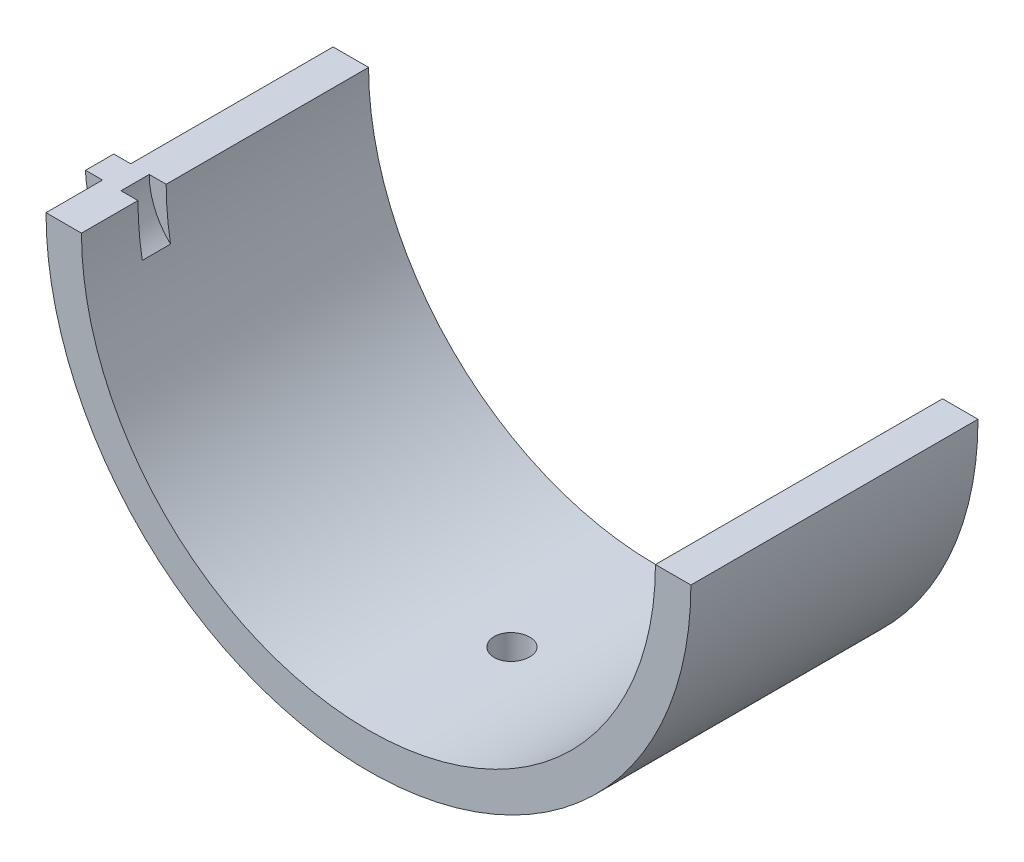
ISO-10303-21;
HEADER;
FILE_DESCRIPTION(('STEP AP214'),'2;1');
FILE_NAME('part.step','',(''),(''),'','','');
FILE_SCHEMA(('AUTOMOTIVE_DESIGN { 1 0 10303 214 1 1 1 1 }'));
ENDSEC;
DATA;
#1=APPLICATION_CONTEXT('core data for automotive mechanical design processes');
#2=APPLICATION_PROTOCOL_DEFINITION('international standard','automotive_design',2000,#1);
#3=PRODUCT_CONTEXT('',#1,'mechanical');
#4=PRODUCT('Part','Part','',(#3));
#5=PRODUCT_RELATED_PRODUCT_CATEGORY('part','',(#4));
#6=PRODUCT_DEFINITION_FORMATION('','',#4);
#7=PRODUCT_DEFINITION_CONTEXT('part definition',#1,'design');
#8=PRODUCT_DEFINITION('design','',#6,#7);
#9=PRODUCT_DEFINITION_SHAPE('','',#8);
#10=(LENGTH_UNIT() NAMED_UNIT(*) SI_UNIT(.MILLI.,.METRE.));
#11=(NAMED_UNIT(*) PLANE_ANGLE_UNIT() SI_UNIT($,.RADIAN.));
#12=(NAMED_UNIT(*) SI_UNIT($,.STERADIAN.) SOLID_ANGLE_UNIT());
#13=UNCERTAINTY_MEASURE_WITH_UNIT(LENGTH_MEASURE(1.E-05),#10,'distance_accuracy_value','');
#14=(GEOMETRIC_REPRESENTATION_CONTEXT(3) GLOBAL_UNCERTAINTY_ASSIGNED_CONTEXT((#13)) GLOBAL_UNIT_ASSIGNED_CONTEXT((#10,
#11,#12)) REPRESENTATION_CONTEXT('',''));
#15=CARTESIAN_POINT('',(0.,0.,0.));
#16=DIRECTION('',(0.,0.,1.));
#17=DIRECTION('',(1.,0.,0.));
#18=AXIS2_PLACEMENT_3D('',#15,#16,#17);
#19=CARTESIAN_POINT('',(0.,36.2585,-32.2834));
#20=DIRECTION('',(0.,0.,1.));
#21=DIRECTION('',(1.,0.,0.));
#22=AXIS2_PLACEMENT_3D('',#19,#20,#21);
#23=CYLINDRICAL_SURFACE('',#22,32.2707);
#24=CARTESIAN_POINT('',(0.,3.9878,-18.1356));
#25=CARTESIAN_POINT('',(-0.111883720965796,3.98780081920386,-18.1355950761488));
#26=CARTESIAN_POINT('',(-0.223845845521155,3.98838808075675,-18.1261511587798));
#27=CARTESIAN_POINT('',(-0.444678748679906,3.99067432506378,-18.0886129498975));
#28=CARTESIAN_POINT('',(-0.553545772229292,3.99237460273192,-18.0604969341903));
#29=CARTESIAN_POINT('',(-0.764957720170871,3.9966945261963,-17.9864250053829));
#30=CARTESIAN_POINT('',(-0.867505939504267,3.99931368798819,-17.9404784828055));
#31=CARTESIAN_POINT('',(-1.06340753096142,4.00517677220651,-17.832064966411));
#32=CARTESIAN_POINT('',(-1.15676300621097,4.00842055122807,-17.7696017634055));
#33=CARTESIAN_POINT('',(-1.33179291448575,4.01517355764292,-17.6298274868831));
#34=CARTESIAN_POINT('',(-1.41345208951588,4.01868312280184,-17.5524973215542));
#35=CARTESIAN_POINT('',(-1.56264093678828,4.02556926803477,-17.3852235216798));
#36=CARTESIAN_POINT('',(-1.63017001945481,4.02894584255499,-17.2952793610789));
#37=CARTESIAN_POINT('',(-1.74922855340307,4.03518781878228,-17.1052446629456));
#38=CARTESIAN_POINT('',(-1.80074536555468,4.03805281592557,-17.0051461924478));
#39=CARTESIAN_POINT('',(-1.88623609918742,4.04294419154457,-16.7976999298791));
#40=CARTESIAN_POINT('',(-1.92021020582116,4.04497057887124,-16.6903522143331));
#41=CARTESIAN_POINT('',(-1.96960887668667,4.04795300982531,-16.4716013505147));
#42=CARTESIAN_POINT('',(-1.98505729255107,4.04891042962738,-16.3602036075208));
#43=CARTESIAN_POINT('',(-1.99703968513226,4.04965107919406,-16.1363923125398));
#44=CARTESIAN_POINT('',(-1.9935738719682,4.04943432200266,-16.0239787718512));
#45=CARTESIAN_POINT('',(-1.96784598637049,4.04785233901447,-15.8014893893565));
#46=CARTESIAN_POINT('',(-1.94560972258169,4.04648869015886,-15.6914105503599));
#47=CARTESIAN_POINT('',(-1.88301217035902,4.04276908353941,-15.4765508628513));
#48=CARTESIAN_POINT('',(-1.84265077533629,4.04041311994005,-15.3717700454996));
#49=CARTESIAN_POINT('',(-1.74491936311942,4.03497257341605,-15.1703978195543));
#50=CARTESIAN_POINT('',(-1.68753763471097,4.03188748910188,-15.0738121088258));
#51=CARTESIAN_POINT('',(-1.55740290289923,4.02533687617385,-14.8916341066089));
#52=CARTESIAN_POINT('',(-1.48464973073931,4.02187134338339,-14.8060419358306));
#53=CARTESIAN_POINT('',(-1.3256919303992,4.01494337714836,-14.6481304978105));
#54=CARTESIAN_POINT('',(-1.23946496541327,4.01148095862902,-14.5758337128163));
#55=CARTESIAN_POINT('',(-1.05608556567461,4.00495499945533,-14.4467386929644));
#56=CARTESIAN_POINT('',(-0.958933127185009,4.00189145893743,-14.3899404634079));
#57=CARTESIAN_POINT('',(-0.756446978490678,3.99650823811199,-14.2934567681121));
#58=CARTESIAN_POINT('',(-0.651112863521814,3.99418859463571,-14.2537721496551));
#59=CARTESIAN_POINT('',(-0.435259487506553,3.99055505959109,-14.1926571761113));
#60=CARTESIAN_POINT('',(-0.324740285659748,3.98924115654289,-14.1712266126663));
#61=CARTESIAN_POINT('',(-0.101849042865441,3.98776863933513,-14.1472559331283));
#62=CARTESIAN_POINT('',(0.0105196431104903,3.98760812413584,-14.1446847324652));
#63=CARTESIAN_POINT('',(0.234091608579501,3.98845541461033,-14.158424552581));
#64=CARTESIAN_POINT('',(0.345294893994785,3.98946321434418,-14.1747354773599));
#65=CARTESIAN_POINT('',(0.563291864281994,3.99253245421689,-14.2257508035571));
#66=CARTESIAN_POINT('',(0.670088898084368,3.99459307760706,-14.2604409477043));
#67=CARTESIAN_POINT('',(0.876345139125459,3.99953612659258,-14.3472155073019));
#68=CARTESIAN_POINT('',(0.975804281843257,4.00241855941288,-14.3993000756765));
#69=CARTESIAN_POINT('',(1.16470382988618,4.0086860585828,-14.5194641513295));
#70=CARTESIAN_POINT('',(1.25413100389011,4.01207177535759,-14.5875644239953));
#71=CARTESIAN_POINT('',(1.42029491780066,4.01896262004217,-14.7377965584471));
#72=CARTESIAN_POINT('',(1.49703153550202,4.02246774910146,-14.8199285553378));
#73=CARTESIAN_POINT('',(1.63574132105311,4.0292078645433,-14.9960267965134));
#74=CARTESIAN_POINT('',(1.6976943259947,4.03244247811934,-15.0900089390133));
#75=CARTESIAN_POINT('',(1.80494035233982,4.03827086171245,-15.2870597282613));
#76=CARTESIAN_POINT('',(1.85023347458754,4.04086463560858,-15.3901283200034));
#77=CARTESIAN_POINT('',(1.92283910089149,4.04511614781028,-15.602352555254));
#78=CARTESIAN_POINT('',(1.9501643058314,4.04677454718073,-15.7115038397928));
#79=CARTESIAN_POINT('',(1.98609991940222,4.0489701256377,-15.9328556378992));
#80=CARTESIAN_POINT('',(1.9947105087489,4.04950731555107,-16.045056122012));
#81=CARTESIAN_POINT('',(1.99297072878972,4.04939963358713,-16.2691208553351));
#82=CARTESIAN_POINT('',(1.98265205997846,4.04875673797713,-16.3809853530192));
#83=CARTESIAN_POINT('',(1.94341238395158,4.04636551882576,-16.6013901988484));
#84=CARTESIAN_POINT('',(1.91449134290751,4.04461719327416,-16.7099305409482));
#85=CARTESIAN_POINT('',(1.83887497917196,4.04021261812829,-16.9206109112672));
#86=CARTESIAN_POINT('',(1.79217976475744,4.03755637406489,-17.0227509784714));
#87=CARTESIAN_POINT('',(1.68234498425625,4.03163534861816,-17.2177454955171));
#88=CARTESIAN_POINT('',(1.61920584905886,4.02837058318088,-17.3106001885803));
#89=CARTESIAN_POINT('',(1.47815851498716,4.02159405823651,-17.4845487774866));
#90=CARTESIAN_POINT('',(1.40022744118492,4.0180819215451,-17.5656241097403));
#91=CARTESIAN_POINT('',(1.23183832809018,4.01120960824321,-17.7135693788049));
#92=CARTESIAN_POINT('',(1.1413772274871,4.00784946903541,-17.780435833984));
#93=CARTESIAN_POINT('',(0.950394954363368,4.00165636867488,-17.898113354332));
#94=CARTESIAN_POINT('',(0.849861648621392,3.99882405538549,-17.9489047413417));
#95=CARTESIAN_POINT('',(0.641749937373601,3.99401450919312,-18.0328251203238));
#96=CARTESIAN_POINT('',(0.534179954306609,3.99203627482298,-18.0659748090935));
#97=CARTESIAN_POINT('',(0.354959357839513,3.9896764947541,-18.1050499610121));
#98=CARTESIAN_POINT('',(0.284467363280514,3.98897593436668,-18.1164914235211));
#99=CARTESIAN_POINT('',(0.142660872419079,3.98803742610515,-18.1317680078167));
#100=CARTESIAN_POINT('',(0.0713463772256011,3.9877994776074,-18.1356031398575));
#101=CARTESIAN_POINT('',(0.,3.9878,-18.1356));
#102=B_SPLINE_CURVE_WITH_KNOTS('',3,(#24,#25,#26,#27,#28,#29,#30,#31,#32,#33,#34,#35,#36,#37,
#38,#39,#40,#41,#42,#43,#44,#45,#46,#47,#48,#49,#50,#51,#52,#53,#54,#55,#56,#57,#58,#59,#60,#61,
#62,#63,#64,#65,#66,#67,#68,#69,#70,#71,#72,#73,#74,#75,#76,#77,#78,#79,#80,#81,#82,#83,#84,#85,
#86,#87,#88,#89,#90,#91,#92,#93,#94,#95,#96,#97,#98,#99,#100,#101),.UNSPECIFIED.,.T.,.F.,(4,2,2,
2,2,2,2,2,2,2,2,2,2,2,2,2,2,2,2,2,2,2,2,2,2,2,2,2,2,2,2,2,2,2,2,2,2,2,4),(0.,0.335390707243431,
0.671172312560252,1.00677731633736,1.34230536078203,1.67826719602565,2.0142430464269,
2.35048342653203,2.68672025775144,3.02252372119828,3.3583234541946,3.69366222616386,
4.02900297019306,4.36457499016749,4.70015069443791,5.03628873535709,5.3724268912468,
5.70858168717771,6.04473264606852,6.38032942605115,6.71592449980721,7.05125962348716,
7.38659769536466,7.72237297519129,8.05815148821871,8.39438537458842,8.73061722566201,
9.06661115013729,9.40260183010715,9.73803034600408,10.0734594718802,10.4088865544172,
10.7443048484544,11.0802461382436,11.4162696497726,11.7527029247478,12.0887406296721,
12.302613961462,12.5164870049252),.UNSPECIFIED.);
#103=CARTESIAN_POINT('',(0.,3.9878,-18.1356));
#104=VERTEX_POINT('',#103);
#105=EDGE_CURVE('E170',#104,#104,#102,.T.);
#106=ORIENTED_EDGE('',*,*,#105,.F.);
#107=EDGE_LOOP('',(#106));
#108=FACE_BOUND('',#107,.T.);
#109=DIRECTION('',(0.,0.,1.));
#110=VECTOR('',#109,1.);
#111=CARTESIAN_POINT('',(-32.2707,36.2585,-32.2834));
#112=LINE('',#111,#110);
#113=CARTESIAN_POINT('',(-32.2707,36.2585,-32.2834));
#114=VERTEX_POINT('',#113);
#115=CARTESIAN_POINT('',(-32.2707,36.2584999999998,-9.525));
#116=VERTEX_POINT('',#115);
#117=EDGE_CURVE('E133',#114,#116,#112,.T.);
#118=ORIENTED_EDGE('',*,*,#117,.T.);
#119=CARTESIAN_POINT('',(0.,36.2584999999999,-9.525));
#120=DIRECTION('',(0.,0.,1.));
#121=DIRECTION('',(1.,0.,0.));
#122=AXIS2_PLACEMENT_3D('',#119,#120,#121);
#123=CIRCLE('',#122,32.2707);
#124=CARTESIAN_POINT('',(-31.7833199892581,30.6711348830217,-9.525));
#125=VERTEX_POINT('',#124);
#126=EDGE_CURVE('E118',#116,#125,#123,.T.);
#127=ORIENTED_EDGE('',*,*,#126,.T.);
#128=DIRECTION('',(0.,0.,1.));
#129=VECTOR('',#128,1.);
#130=CARTESIAN_POINT('',(-31.7833199892581,30.6711348830217,-9.525));
#131=LINE('',#130,#129);
#132=CARTESIAN_POINT('',(-31.7833199892581,30.6711348830217,-6.35));
#133=VERTEX_POINT('',#132);
#134=EDGE_CURVE('E125',#125,#133,#131,.T.);
#135=ORIENTED_EDGE('',*,*,#134,.T.);
#136=CARTESIAN_POINT('',(0.,36.2584999999999,-6.35));
#137=DIRECTION('',(0.,0.,1.));
#138=DIRECTION('',(1.,0.,0.));
#139=AXIS2_PLACEMENT_3D('',#136,#137,#138);
#140=CIRCLE('',#139,32.2707);
#141=CARTESIAN_POINT('',(-32.2707,36.2584999999998,-6.35));
#142=VERTEX_POINT('',#141);
#143=EDGE_CURVE('E140',#142,#133,#140,.T.);
#144=ORIENTED_EDGE('',*,*,#143,.F.);
#145=CARTESIAN_POINT('',(-32.2707,36.2585,0.));
#146=VERTEX_POINT('',#145);
#147=EDGE_CURVE('E250',#142,#146,#112,.T.);
#148=ORIENTED_EDGE('',*,*,#147,.T.);
#149=CARTESIAN_POINT('',(0.,36.2585,0.));
#150=DIRECTION('',(0.,0.,-1.));
#151=DIRECTION('',(-1.,0.,0.));
#152=AXIS2_PLACEMENT_3D('',#149,#150,#151);
#153=CIRCLE('',#152,32.2707);
#154=CARTESIAN_POINT('',(32.2707,36.2585,0.));
#155=VERTEX_POINT('',#154);
#156=EDGE_CURVE('E233',#155,#146,#153,.T.);
#157=ORIENTED_EDGE('',*,*,#156,.F.);
#158=DIRECTION('',(0.,0.,1.));
#159=VECTOR('',#158,1.);
#160=CARTESIAN_POINT('',(32.2707,36.2585,-32.2834));
#161=LINE('',#160,#159);
#162=CARTESIAN_POINT('',(32.2707,36.2585,-32.2834));
#163=VERTEX_POINT('',#162);
#164=EDGE_CURVE('E229',#163,#155,#161,.T.);
#165=ORIENTED_EDGE('',*,*,#164,.F.);
#166=CARTESIAN_POINT('',(0.,36.2585,-32.2834));
#167=DIRECTION('',(0.,0.,-1.));
#168=DIRECTION('',(-1.,0.,0.));
#169=AXIS2_PLACEMENT_3D('',#166,#167,#168);
#170=CIRCLE('',#169,32.2707);
#171=EDGE_CURVE('E253',#163,#114,#170,.T.);
#172=ORIENTED_EDGE('',*,*,#171,.T.);
#173=EDGE_LOOP('',(#118,#127,#135,#144,#148,#157,#165,#172));
#174=FACE_BOUND('',#173,.T.);
#175=ADVANCED_FACE('F36',(#108,#174),#23,.F.);
#176=CARTESIAN_POINT('',(-36.2585,36.2585,-32.2834));
#177=DIRECTION('',(0.,1.,0.));
#178=DIRECTION('',(0.,0.,1.));
#179=AXIS2_PLACEMENT_3D('',#176,#177,#178);
#180=PLANE('',#179);
#181=DIRECTION('',(0.,0.,1.));
#182=VECTOR('',#181,1.);
#183=CARTESIAN_POINT('',(-34.1757,36.2585,-9.525));
#184=LINE('',#183,#182);
#185=CARTESIAN_POINT('',(-34.1757,36.2585,-9.525));
#186=VERTEX_POINT('',#185);
#187=CARTESIAN_POINT('',(-34.1757,36.2585,-6.35));
#188=VERTEX_POINT('',#187);
#189=EDGE_CURVE('E129',#186,#188,#184,.T.);
#190=ORIENTED_EDGE('',*,*,#189,.F.);
#191=DIRECTION('',(-1.,1.12916383738123E-13,0.));
#192=VECTOR('',#191,1.);
#193=CARTESIAN_POINT('',(-32.2707,36.2584999999998,-9.525));
#194=LINE('',#193,#192);
#195=EDGE_CURVE('E120',#116,#186,#194,.T.);
#196=ORIENTED_EDGE('',*,*,#195,.F.);
#197=ORIENTED_EDGE('',*,*,#117,.F.);
#198=DIRECTION('',(-1.,0.,0.));
#199=VECTOR('',#198,1.);
#200=CARTESIAN_POINT('',(-36.2585,36.2585,-32.2834));
#201=LINE('',#200,#199);
#202=CARTESIAN_POINT('',(-36.2585,36.2585,-32.2834));
#203=VERTEX_POINT('',#202);
#204=EDGE_CURVE('E244',#114,#203,#201,.T.);
#205=ORIENTED_EDGE('',*,*,#204,.T.);
#206=DIRECTION('',(0.,0.,1.));
#207=VECTOR('',#206,1.);
#208=CARTESIAN_POINT('',(-36.2585,36.2585,-32.2834));
#209=LINE('',#208,#207);
#210=CARTESIAN_POINT('',(-36.2585,36.2585,-9.525));
#211=VERTEX_POINT('',#210);
#212=EDGE_CURVE('E11',#203,#211,#209,.T.);
#213=ORIENTED_EDGE('',*,*,#212,.T.);
#214=DIRECTION('',(-1.,0.,0.));
#215=VECTOR('',#214,1.);
#216=CARTESIAN_POINT('',(-36.2585,36.2585,-9.525));
#217=LINE('',#216,#215);
#218=CARTESIAN_POINT('',(-38.1635,36.2585,-9.525));
#219=VERTEX_POINT('',#218);
#220=EDGE_CURVE('E144',#211,#219,#217,.T.);
#221=ORIENTED_EDGE('',*,*,#220,.T.);
#222=DIRECTION('',(0.,0.,1.));
#223=VECTOR('',#222,1.);
#224=CARTESIAN_POINT('',(-38.1635,36.2585,-9.525));
#225=LINE('',#224,#223);
#226=CARTESIAN_POINT('',(-38.1635,36.2585,-6.35));
#227=VERTEX_POINT('',#226);
#228=EDGE_CURVE('E152',#219,#227,#225,.T.);
#229=ORIENTED_EDGE('',*,*,#228,.T.);
#230=DIRECTION('',(-1.,0.,0.));
#231=VECTOR('',#230,1.);
#232=CARTESIAN_POINT('',(-36.2585,36.2585,-6.35));
#233=LINE('',#232,#231);
#234=CARTESIAN_POINT('',(-36.2585,36.2585,-6.35));
#235=VERTEX_POINT('',#234);
#236=EDGE_CURVE('E61',#235,#227,#233,.T.);
#237=ORIENTED_EDGE('',*,*,#236,.F.);
#238=CARTESIAN_POINT('',(-36.2585,36.2585,0.));
#239=VERTEX_POINT('',#238);
#240=EDGE_CURVE('E45',#235,#239,#209,.T.);
#241=ORIENTED_EDGE('',*,*,#240,.T.);
#242=DIRECTION('',(-1.,0.,0.));
#243=VECTOR('',#242,1.);
#244=CARTESIAN_POINT('',(-36.2585,36.2585,0.));
#245=LINE('',#244,#243);
#246=EDGE_CURVE('E239',#146,#239,#245,.T.);
#247=ORIENTED_EDGE('',*,*,#246,.F.);
#248=ORIENTED_EDGE('',*,*,#147,.F.);
#249=DIRECTION('',(-1.,1.12916383738123E-13,0.));
#250=VECTOR('',#249,1.);
#251=CARTESIAN_POINT('',(-32.2707,36.2584999999998,-6.35));
#252=LINE('',#251,#250);
#253=EDGE_CURVE('E134',#142,#188,#252,.T.);
#254=ORIENTED_EDGE('',*,*,#253,.T.);
#255=EDGE_LOOP('',(#190,#196,#197,#205,#213,#221,#229,#237,#241,#247,#248,#254));
#256=FACE_BOUND('',#255,.T.);
#257=ADVANCED_FACE('F203',(#256),#180,.T.);
#258=CARTESIAN_POINT('',(0.,36.2585,-32.2834));
#259=DIRECTION('',(0.,0.,1.));
#260=DIRECTION('',(1.,0.,0.));
#261=AXIS2_PLACEMENT_3D('',#258,#259,#260);
#262=CYLINDRICAL_SURFACE('',#261,36.2585);
#263=CARTESIAN_POINT('',(0.,36.2585,-9.525));
#264=DIRECTION('',(0.,0.,1.));
#265=DIRECTION('',(1.,0.,0.));
#266=AXIS2_PLACEMENT_3D('',#263,#264,#265);
#267=CIRCLE('',#266,36.2585);
#268=CARTESIAN_POINT('',(-35.8254123953873,30.6711348830217,-9.525));
#269=VERTEX_POINT('',#268);
#270=EDGE_CURVE('E150',#211,#269,#267,.T.);
#271=ORIENTED_EDGE('',*,*,#270,.F.);
#272=ORIENTED_EDGE('',*,*,#212,.F.);
#273=CARTESIAN_POINT('',(0.,36.2585,-32.2834));
#274=DIRECTION('',(0.,0.,1.));
#275=DIRECTION('',(1.,0.,0.));
#276=AXIS2_PLACEMENT_3D('',#273,#274,#275);
#277=CIRCLE('',#276,36.2585);
#278=CARTESIAN_POINT('',(36.2585,36.2585,-32.2834));
#279=VERTEX_POINT('',#278);
#280=EDGE_CURVE('E248',#203,#279,#277,.T.);
#281=ORIENTED_EDGE('',*,*,#280,.T.);
#282=DIRECTION('',(0.,0.,1.));
#283=VECTOR('',#282,1.);
#284=CARTESIAN_POINT('',(36.2585,36.2585,-32.2834));
#285=LINE('',#284,#283);
#286=CARTESIAN_POINT('',(36.2585,36.2585,0.));
#287=VERTEX_POINT('',#286);
#288=EDGE_CURVE('E40',#279,#287,#285,.T.);
#289=ORIENTED_EDGE('',*,*,#288,.T.);
#290=CARTESIAN_POINT('',(0.,36.2585,0.));
#291=DIRECTION('',(0.,0.,1.));
#292=DIRECTION('',(1.,0.,0.));
#293=AXIS2_PLACEMENT_3D('',#290,#291,#292);
#294=CIRCLE('',#293,36.2585);
#295=EDGE_CURVE('E234',#239,#287,#294,.T.);
#296=ORIENTED_EDGE('',*,*,#295,.F.);
#297=ORIENTED_EDGE('',*,*,#240,.F.);
#298=CARTESIAN_POINT('',(0.,36.2585,-6.35));
#299=DIRECTION('',(0.,0.,1.));
#300=DIRECTION('',(1.,0.,0.));
#301=AXIS2_PLACEMENT_3D('',#298,#299,#300);
#302=CIRCLE('',#301,36.2585);
#303=CARTESIAN_POINT('',(-35.8254123953873,30.6711348830217,-6.35));
#304=VERTEX_POINT('',#303);
#305=EDGE_CURVE('E148',#235,#304,#302,.T.);
#306=ORIENTED_EDGE('',*,*,#305,.T.);
#307=DIRECTION('',(0.,0.,1.));
#308=VECTOR('',#307,1.);
#309=CARTESIAN_POINT('',(-35.8254123953873,30.6711348830217,-9.525));
#310=LINE('',#309,#308);
#311=EDGE_CURVE('E159',#269,#304,#310,.T.);
#312=ORIENTED_EDGE('',*,*,#311,.F.);
#313=EDGE_LOOP('',(#271,#272,#281,#289,#296,#297,#306,#312));
#314=FACE_BOUND('',#313,.T.);
#315=CARTESIAN_POINT('',(0.,0.,-18.1356));
#316=CARTESIAN_POINT('',(0.111907497564102,7.31751249656478E-07,-18.1355950666039));
#317=CARTESIAN_POINT('',(0.223893982332885,0.00052362921698291,-18.1261471512651));
#318=CARTESIAN_POINT('',(0.444776564386185,0.0025593011327887,-18.0885921356149));
#319=CARTESIAN_POINT('',(0.553668880574012,0.00407323657485807,-18.060463150037));
#320=CARTESIAN_POINT('',(0.765131535228614,0.00791966415961179,-17.9863547529116));
#321=CARTESIAN_POINT('',(0.867705106102728,0.0102517336216689,-17.9403845575427));
#322=CARTESIAN_POINT('',(1.06365240177651,0.0154719141817283,-17.8319131217274));
#323=CARTESIAN_POINT('',(1.15702826715554,0.0183598954381324,-17.7694157401833));
#324=CARTESIAN_POINT('',(1.33206828668269,0.024370964521833,-17.62958166608));
#325=CARTESIAN_POINT('',(1.41372008149629,0.0274942952401027,-17.5522295116791));
#326=CARTESIAN_POINT('',(1.56288867525733,0.0336219593695912,-17.3849129681518));
#327=CARTESIAN_POINT('',(1.63040489191561,0.036626287874601,-17.2949480597208));
#328=CARTESIAN_POINT('',(1.7494217135664,0.0421789448952609,-17.1048925752576));
#329=CARTESIAN_POINT('',(1.80091238417504,0.044726990142817,-17.0047957691111));
#330=CARTESIAN_POINT('',(1.88635282828777,0.0490766963309409,-16.797361648308));
#331=CARTESIAN_POINT('',(1.9203027555556,0.0508783638142961,-16.690024397131));
#332=CARTESIAN_POINT('',(1.96966458509788,0.0535298922362614,-16.4712724884985));
#333=CARTESIAN_POINT('',(1.98509538320816,0.0543807232915954,-16.3598621068756));
#334=CARTESIAN_POINT('',(1.99703924395536,0.0550375408693546,-16.1360294250703));
#335=CARTESIAN_POINT('',(1.9935524800771,0.0548435369735117,-16.0236071341773));
#336=CARTESIAN_POINT('',(1.96777590752511,0.053433463556909,-15.8010704443173));
#337=CARTESIAN_POINT('',(1.9455065260168,0.0522185043883879,-15.6909536712469));
#338=CARTESIAN_POINT('',(1.88282853083677,0.0489051996620229,-15.4760236791855));
#339=CARTESIAN_POINT('',(1.84241982855164,0.0468068497886807,-15.3712104861062));
#340=CARTESIAN_POINT('',(1.74458696905306,0.0419619746433298,-15.1697971706533));
#341=CARTESIAN_POINT('',(1.68715351621635,0.0392150954373258,-15.0732015723181));
#342=CARTESIAN_POINT('',(1.55690823734416,0.0333831032438999,-14.8910149120691));
#343=CARTESIAN_POINT('',(1.48409627878013,0.0302979873417392,-14.805423945001));
#344=CARTESIAN_POINT('',(1.32504566280744,0.0241322919892767,-14.6475572849759));
#345=CARTESIAN_POINT('',(1.23878932033998,0.0210517239877151,-14.575299408061));
#346=CARTESIAN_POINT('',(1.05536053156776,0.0152462549702659,-14.4462874003243));
#347=CARTESIAN_POINT('',(0.958188082192795,0.0125213540544111,-14.3895332738629));
#348=CARTESIAN_POINT('',(0.755674881990182,0.00773414842263724,-14.2931414408636));
#349=CARTESIAN_POINT('',(0.650333825203743,0.00567186854037566,-14.2535043758184));
#350=CARTESIAN_POINT('',(0.434478353609496,0.00244266534377197,-14.1924835565632));
#351=CARTESIAN_POINT('',(0.32396398561948,0.00127573392830447,-14.1710996371982));
#352=CARTESIAN_POINT('',(0.101053621485617,-3.02226091046313E-05,-14.1472141222606));
#353=CARTESIAN_POINT('',(-0.011339727013181,-0.000170589008594897,-14.1446878877409));
#354=CARTESIAN_POINT('',(-0.234953555971432,0.000588839598904402,-14.1585251243454));
#355=CARTESIAN_POINT('',(-0.346174041136005,0.00148863043154213,-14.1748885196617));
#356=CARTESIAN_POINT('',(-0.564215824248044,0.00422618382066366,-14.2260201233));
#357=CARTESIAN_POINT('',(-0.671039772953259,0.00606337197673949,-14.2607770612628));
#358=CARTESIAN_POINT('',(-0.877337859956386,0.0104689349877976,-14.3476976951563));
#359=CARTESIAN_POINT('',(-0.976811947027025,0.0130373149384558,-14.3998615123959));
#360=CARTESIAN_POINT('',(-1.16569962827012,0.0186197998447334,-14.5201781139379));
#361=CARTESIAN_POINT('',(-1.2551027025375,0.0216343634059847,-14.5883473920803));
#362=CARTESIAN_POINT('',(-1.42120471153627,0.0277682731257775,-14.7387157757274));
#363=CARTESIAN_POINT('',(-1.49790354856745,0.0308876200899196,-14.8209149891176));
#364=CARTESIAN_POINT('',(-1.63650302835212,0.0368833678100331,-14.9971160193108));
#365=CARTESIAN_POINT('',(-1.69838771355669,0.0397595044471405,-15.0911303985056));
#366=CARTESIAN_POINT('',(-1.80549311525343,0.0449403239305538,-15.2882296918552));
#367=CARTESIAN_POINT('',(-1.8507139155932,0.0472450096522076,-15.3913145603669));
#368=CARTESIAN_POINT('',(-1.9231801408886,0.0510211389455005,-15.603569822905));
#369=CARTESIAN_POINT('',(-1.95043569045701,0.0524930517736422,-15.7127367515977));
#370=CARTESIAN_POINT('',(-1.98623082528461,0.0544389620387945,-15.9341056439059));
#371=CARTESIAN_POINT('',(-1.99477054636194,0.054912966717483,-16.0463075854908));
#372=CARTESIAN_POINT('',(-1.99289033240598,0.0548094313922789,-16.2704027371027));
#373=CARTESIAN_POINT('',(-1.9824954940817,0.0542332833070132,-16.3822961592086));
#374=CARTESIAN_POINT('',(-1.94309316993224,0.0520973187509269,-16.6027465425745));
#375=CARTESIAN_POINT('',(-1.91408564923212,0.0505375004369849,-16.7113034975825));
#376=CARTESIAN_POINT('',(-1.83828672656218,0.0466103141758671,-16.9220040523546));
#377=CARTESIAN_POINT('',(-1.79149527805936,0.044242944115673,-17.0241476353368));
#378=CARTESIAN_POINT('',(-1.68146065297569,0.0389675228035289,-17.2191314275393));
#379=CARTESIAN_POINT('',(-1.61821795180355,0.0360594871764388,-17.3119719054935));
#380=CARTESIAN_POINT('',(-1.47698475514627,0.0300260315270433,-17.4858403643581));
#381=CARTESIAN_POINT('',(-1.39897645310004,0.026900351944363,-17.5668538714133));
#382=CARTESIAN_POINT('',(-1.23044406327464,0.0207858887765427,-17.7146616346766));
#383=CARTESIAN_POINT('',(-1.13991690752929,0.0177971389882256,-17.7814523951274));
#384=CARTESIAN_POINT('',(-0.948833629545379,0.0122908686302551,-17.8989565921303));
#385=CARTESIAN_POINT('',(-0.848266964281551,0.00977385160321541,-17.9496528885286));
#386=CARTESIAN_POINT('',(-0.640109942931055,0.00550187034653946,-18.033379940764));
#387=CARTESIAN_POINT('',(-0.532528025304694,0.00374600930841503,-18.0664314966637));
#388=CARTESIAN_POINT('',(-0.35356789561378,0.00165701242070614,-18.1052908143814));
#389=CARTESIAN_POINT('',(-0.283347977545109,0.00103837501038306,-18.1166421789238));
#390=CARTESIAN_POINT('',(-0.142095989751101,0.000209636674026653,-18.1317983341972));
#391=CARTESIAN_POINT('',(-0.0710639208755523,-4.64679436481791E-07,-18.1356031328238));
#392=CARTESIAN_POINT('',(0.,0.,-18.1356));
#393=B_SPLINE_CURVE_WITH_KNOTS('',3,(#315,#316,#317,#318,#319,#320,#321,#322,#323,#324,#325,
#326,#327,#328,#329,#330,#331,#332,#333,#334,#335,#336,#337,#338,#339,#340,#341,#342,#343,#344,
#345,#346,#347,#348,#349,#350,#351,#352,#353,#354,#355,#356,#357,#358,#359,#360,#361,#362,#363,
#364,#365,#366,#367,#368,#369,#370,#371,#372,#373,#374,#375,#376,#377,#378,#379,#380,#381,#382,
#383,#384,#385,#386,#387,#388,#389,#390,#391,#392),.UNSPECIFIED.,.T.,.F.,(4,2,2,2,2,2,2,2,2,2,2,
2,2,2,2,2,2,2,2,2,2,2,2,2,2,2,2,2,2,2,2,2,2,2,2,2,2,2,4),(0.,0.33546307706808,0.671319851083663,
1.00700336302425,1.34260856593473,1.67856500130769,2.01453527306692,2.35071340296421,
2.68688858584362,3.02272046281526,3.35854926002253,3.69401329455174,4.02947896789293,
4.36512814609805,4.70078021697153,5.03687759785715,5.37297507327131,5.7090851434506,
6.04519217246542,6.38085997602643,6.7165264324924,7.05198745225753,7.38745080990788,
7.72326139617636,8.0590745648303,8.39524785410657,8.73141945183807,9.06740143217854,
9.40338097433705,9.7389155182325,10.0744506908272,10.4099867413811,10.7455130966828,
11.0814466877683,11.417462751691,11.75383547213,12.0898107874547,12.3028380378732,
12.5158650654125),.UNSPECIFIED.);
#394=CARTESIAN_POINT('',(0.,0.,-18.1356));
#395=VERTEX_POINT('',#394);
#396=EDGE_CURVE('E161',#395,#395,#393,.T.);
#397=ORIENTED_EDGE('',*,*,#396,.F.);
#398=EDGE_LOOP('',(#397));
#399=FACE_BOUND('',#398,.T.);
#400=ADVANCED_FACE('F38',(#314,#399),#262,.T.);
#401=CARTESIAN_POINT('',(32.2707,36.2585,-32.2834));
#402=DIRECTION('',(0.,1.,0.));
#403=DIRECTION('',(0.,0.,1.));
#404=AXIS2_PLACEMENT_3D('',#401,#402,#403);
#405=PLANE('',#404);
#406=DIRECTION('',(-1.,0.,0.));
#407=VECTOR('',#406,1.);
#408=CARTESIAN_POINT('',(32.2707,36.2585,0.));
#409=LINE('',#408,#407);
#410=EDGE_CURVE('E225',#287,#155,#409,.T.);
#411=ORIENTED_EDGE('',*,*,#410,.F.);
#412=ORIENTED_EDGE('',*,*,#288,.F.);
#413=DIRECTION('',(-1.,0.,0.));
#414=VECTOR('',#413,1.);
#415=CARTESIAN_POINT('',(32.2707,36.2585,-32.2834));
#416=LINE('',#415,#414);
#417=EDGE_CURVE('E255',#279,#163,#416,.T.);
#418=ORIENTED_EDGE('',*,*,#417,.T.);
#419=ORIENTED_EDGE('',*,*,#164,.T.);
#420=EDGE_LOOP('',(#411,#412,#418,#419));
#421=FACE_BOUND('',#420,.T.);
#422=ADVANCED_FACE('F212',(#421),#405,.T.);
#423=CARTESIAN_POINT('',(0.,36.2585,-32.2834));
#424=DIRECTION('',(0.,0.,1.));
#425=DIRECTION('',(1.,0.,0.));
#426=AXIS2_PLACEMENT_3D('',#423,#424,#425);
#427=PLANE('',#426);
#428=ORIENTED_EDGE('',*,*,#280,.F.);
#429=ORIENTED_EDGE('',*,*,#204,.F.);
#430=ORIENTED_EDGE('',*,*,#171,.F.);
#431=ORIENTED_EDGE('',*,*,#417,.F.);
#432=EDGE_LOOP('',(#428,#429,#430,#431));
#433=FACE_BOUND('',#432,.T.);
#434=ADVANCED_FACE('F214',(#433),#427,.F.);
#435=CARTESIAN_POINT('',(0.,36.2585,0.));
#436=DIRECTION('',(0.,0.,1.));
#437=DIRECTION('',(1.,0.,0.));
#438=AXIS2_PLACEMENT_3D('',#435,#436,#437);
#439=PLANE('',#438);
#440=ORIENTED_EDGE('',*,*,#295,.T.);
#441=ORIENTED_EDGE('',*,*,#410,.T.);
#442=ORIENTED_EDGE('',*,*,#156,.T.);
#443=ORIENTED_EDGE('',*,*,#246,.T.);
#444=EDGE_LOOP('',(#440,#441,#442,#443));
#445=FACE_BOUND('',#444,.T.);
#446=ADVANCED_FACE('F220',(#445),#439,.T.);
#447=CARTESIAN_POINT('',(0.,36.2595,-16.1417));
#448=DIRECTION('',(0.,-1.,0.));
#449=DIRECTION('',(0.,0.,-1.));
#450=AXIS2_PLACEMENT_3D('',#447,#448,#449);
#451=CYLINDRICAL_SURFACE('',#450,1.9939);
#452=ORIENTED_EDGE('',*,*,#396,.T.);
#453=EDGE_LOOP('',(#452));
#454=FACE_BOUND('',#453,.T.);
#455=ORIENTED_EDGE('',*,*,#105,.T.);
#456=EDGE_LOOP('',(#455));
#457=FACE_BOUND('',#456,.T.);
#458=ADVANCED_FACE('F176',(#454,#457),#451,.F.);
#459=CARTESIAN_POINT('',(-30.3183485769105,36.2585,-9.525));
#460=DIRECTION('',(0.,0.,1.));
#461=DIRECTION('',(1.,0.,0.));
#462=AXIS2_PLACEMENT_3D('',#459,#460,#461);
#463=CYLINDRICAL_SURFACE('',#462,7.84515142308949);
#464=CARTESIAN_POINT('',(-30.3183485769105,36.2585,-6.35));
#465=DIRECTION('',(0.,0.,-1.));
#466=DIRECTION('',(-1.,0.,0.));
#467=AXIS2_PLACEMENT_3D('',#464,#465,#466);
#468=CIRCLE('',#467,7.84515142308949);
#469=EDGE_CURVE('E154',#304,#227,#468,.T.);
#470=ORIENTED_EDGE('',*,*,#469,.T.);
#471=ORIENTED_EDGE('',*,*,#228,.F.);
#472=CARTESIAN_POINT('',(-30.3183485769105,36.2585,-9.525));
#473=DIRECTION('',(0.,0.,-1.));
#474=DIRECTION('',(-1.,0.,0.));
#475=AXIS2_PLACEMENT_3D('',#472,#473,#474);
#476=CIRCLE('',#475,7.84515142308949);
#477=EDGE_CURVE('E147',#269,#219,#476,.T.);
#478=ORIENTED_EDGE('',*,*,#477,.F.);
#479=ORIENTED_EDGE('',*,*,#311,.T.);
#480=EDGE_LOOP('',(#470,#471,#478,#479));
#481=FACE_BOUND('',#480,.T.);
#482=ADVANCED_FACE('F182',(#481),#463,.T.);
#483=CARTESIAN_POINT('',(-30.3183485769105,36.2585,-9.525));
#484=DIRECTION('',(0.,0.,-1.));
#485=DIRECTION('',(-1.,0.,0.));
#486=AXIS2_PLACEMENT_3D('',#483,#484,#485);
#487=PLANE('',#486);
#488=ORIENTED_EDGE('',*,*,#220,.F.);
#489=ORIENTED_EDGE('',*,*,#270,.T.);
#490=ORIENTED_EDGE('',*,*,#477,.T.);
#491=EDGE_LOOP('',(#488,#489,#490));
#492=FACE_BOUND('',#491,.T.);
#493=ADVANCED_FACE('F185',(#492),#487,.T.);
#494=CARTESIAN_POINT('',(-30.3183485769105,36.2585,-6.35));
#495=DIRECTION('',(0.,0.,-1.));
#496=DIRECTION('',(-1.,0.,0.));
#497=AXIS2_PLACEMENT_3D('',#494,#495,#496);
#498=PLANE('',#497);
#499=ORIENTED_EDGE('',*,*,#236,.T.);
#500=ORIENTED_EDGE('',*,*,#469,.F.);
#501=ORIENTED_EDGE('',*,*,#305,.F.);
#502=EDGE_LOOP('',(#499,#500,#501));
#503=FACE_BOUND('',#502,.T.);
#504=ADVANCED_FACE('F187',(#503),#498,.F.);
#505=CARTESIAN_POINT('',(-26.4549092183617,36.2585,-9.525));
#506=DIRECTION('',(0.,0.,1.));
#507=DIRECTION('',(1.,0.,0.));
#508=AXIS2_PLACEMENT_3D('',#505,#506,#507);
#509=CYLINDRICAL_SURFACE('',#508,7.72079078163832);
#510=CARTESIAN_POINT('',(-26.4549092183617,36.2585,-6.35));
#511=DIRECTION('',(0.,0.,-1.));
#512=DIRECTION('',(-1.,0.,0.));
#513=AXIS2_PLACEMENT_3D('',#510,#511,#512);
#514=CIRCLE('',#513,7.72079078163832);
#515=EDGE_CURVE('E53',#133,#188,#514,.T.);
#516=ORIENTED_EDGE('',*,*,#515,.F.);
#517=ORIENTED_EDGE('',*,*,#134,.F.);
#518=CARTESIAN_POINT('',(-26.4549092183617,36.2585,-9.525));
#519=DIRECTION('',(0.,0.,-1.));
#520=DIRECTION('',(-1.,0.,0.));
#521=AXIS2_PLACEMENT_3D('',#518,#519,#520);
#522=CIRCLE('',#521,7.72079078163832);
#523=EDGE_CURVE('E114',#125,#186,#522,.T.);
#524=ORIENTED_EDGE('',*,*,#523,.T.);
#525=ORIENTED_EDGE('',*,*,#189,.T.);
#526=EDGE_LOOP('',(#516,#517,#524,#525));
#527=FACE_BOUND('',#526,.T.);
#528=ADVANCED_FACE('F126',(#527),#509,.F.);
#529=CARTESIAN_POINT('',(0.,36.2584999999999,-9.525));
#530=DIRECTION('',(0.,0.,1.));
#531=DIRECTION('',(1.,0.,0.));
#532=AXIS2_PLACEMENT_3D('',#529,#530,#531);
#533=PLANE('',#532);
#534=ORIENTED_EDGE('',*,*,#126,.F.);
#535=ORIENTED_EDGE('',*,*,#195,.T.);
#536=ORIENTED_EDGE('',*,*,#523,.F.);
#537=EDGE_LOOP('',(#534,#535,#536));
#538=FACE_BOUND('',#537,.T.);
#539=ADVANCED_FACE('F116',(#538),#533,.T.);
#540=CARTESIAN_POINT('',(0.,36.2584999999999,-6.35));
#541=DIRECTION('',(0.,0.,1.));
#542=DIRECTION('',(1.,0.,0.));
#543=AXIS2_PLACEMENT_3D('',#540,#541,#542);
#544=PLANE('',#543);
#545=ORIENTED_EDGE('',*,*,#143,.T.);
#546=ORIENTED_EDGE('',*,*,#515,.T.);
#547=ORIENTED_EDGE('',*,*,#253,.F.);
#548=EDGE_LOOP('',(#545,#546,#547));
#549=FACE_BOUND('',#548,.T.);
#550=ADVANCED_FACE('F196',(#549),#544,.F.);
#551=CLOSED_SHELL('',(#175,#257,#400,#422,#434,#446,#458,#482,#493,#504,#528,#539,#550));
#552=MANIFOLD_SOLID_BREP('B2',#551);
#553=ADVANCED_BREP_SHAPE_REPRESENTATION('',(#18,#552),#14);
#554=SHAPE_DEFINITION_REPRESENTATION(#9,#553);
ENDSEC;
END-ISO-10303-21;
